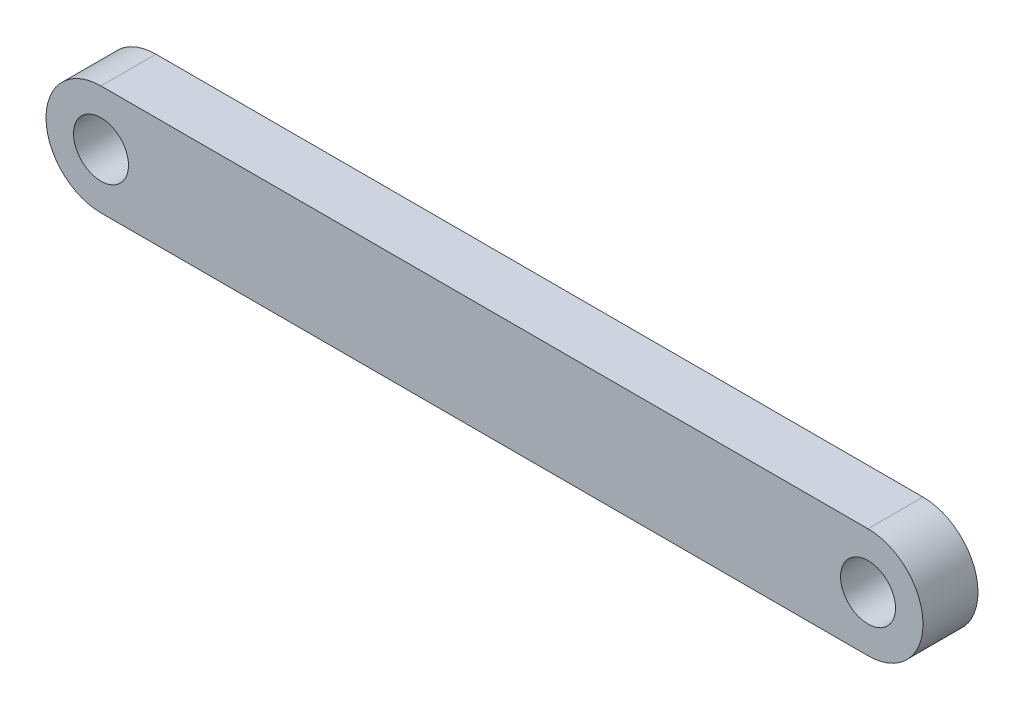
ISO-10303-21;
HEADER;
FILE_DESCRIPTION(('STEP AP214'),'2;1');
FILE_NAME('part.step','',(''),(''),'','','');
FILE_SCHEMA(('AUTOMOTIVE_DESIGN { 1 0 10303 214 1 1 1 1 }'));
ENDSEC;
DATA;
#1=APPLICATION_CONTEXT('core data for automotive mechanical design processes');
#2=APPLICATION_PROTOCOL_DEFINITION('international standard','automotive_design',2000,#1);
#3=PRODUCT_CONTEXT('',#1,'mechanical');
#4=PRODUCT('Part','Part','',(#3));
#5=PRODUCT_RELATED_PRODUCT_CATEGORY('part','',(#4));
#6=PRODUCT_DEFINITION_FORMATION('','',#4);
#7=PRODUCT_DEFINITION_CONTEXT('part definition',#1,'design');
#8=PRODUCT_DEFINITION('design','',#6,#7);
#9=PRODUCT_DEFINITION_SHAPE('','',#8);
#10=(LENGTH_UNIT() NAMED_UNIT(*) SI_UNIT(.MILLI.,.METRE.));
#11=(NAMED_UNIT(*) PLANE_ANGLE_UNIT() SI_UNIT($,.RADIAN.));
#12=(NAMED_UNIT(*) SI_UNIT($,.STERADIAN.) SOLID_ANGLE_UNIT());
#13=UNCERTAINTY_MEASURE_WITH_UNIT(LENGTH_MEASURE(1.E-05),#10,'distance_accuracy_value','');
#14=(GEOMETRIC_REPRESENTATION_CONTEXT(3) GLOBAL_UNCERTAINTY_ASSIGNED_CONTEXT((#13)) GLOBAL_UNIT_ASSIGNED_CONTEXT((#10,
#11,#12)) REPRESENTATION_CONTEXT('',''));
#15=CARTESIAN_POINT('',(0.,0.,0.));
#16=DIRECTION('',(0.,0.,1.));
#17=DIRECTION('',(1.,0.,0.));
#18=AXIS2_PLACEMENT_3D('',#15,#16,#17);
#19=CARTESIAN_POINT('',(-13.9499999814304,0.000719785371182922,2.));
#20=DIRECTION('',(0.,0.,1.));
#21=DIRECTION('',(1.,0.,0.));
#22=AXIS2_PLACEMENT_3D('',#19,#20,#21);
#23=PLANE('',#22);
#24=CARTESIAN_POINT('',(-13.9499999814304,0.000719785371182922,2.));
#25=DIRECTION('',(0.,0.,1.));
#26=DIRECTION('',(1.,0.,0.));
#27=AXIS2_PLACEMENT_3D('',#24,#25,#26);
#28=CIRCLE('',#27,1.);
#29=CARTESIAN_POINT('',(-12.9499999814304,0.000719785371182922,2.));
#30=VERTEX_POINT('',#29);
#31=EDGE_CURVE('E100',#30,#30,#28,.T.);
#32=ORIENTED_EDGE('',*,*,#31,.F.);
#33=EDGE_LOOP('',(#32));
#34=FACE_BOUND('',#33,.T.);
#35=CARTESIAN_POINT('',(-13.9499999814304,0.000719785371182922,2.));
#36=DIRECTION('',(0.,0.,1.));
#37=DIRECTION('',(1.,0.,0.));
#38=AXIS2_PLACEMENT_3D('',#35,#36,#37);
#39=CIRCLE('',#38,2.);
#40=CARTESIAN_POINT('',(-13.9499999814304,2.00071978537118,2.));
#41=VERTEX_POINT('',#40);
#42=CARTESIAN_POINT('',(-13.9499999814304,-1.99928021462882,2.));
#43=VERTEX_POINT('',#42);
#44=EDGE_CURVE('E85',#41,#43,#39,.T.);
#45=ORIENTED_EDGE('',*,*,#44,.T.);
#46=DIRECTION('',(1.,0.,0.));
#47=VECTOR('',#46,1.);
#48=CARTESIAN_POINT('',(-13.9499999814304,-1.99928021462882,2.));
#49=LINE('',#48,#47);
#50=CARTESIAN_POINT('',(13.9500000185696,-1.99928021462882,2.));
#51=VERTEX_POINT('',#50);
#52=EDGE_CURVE('E80',#43,#51,#49,.T.);
#53=ORIENTED_EDGE('',*,*,#52,.T.);
#54=CARTESIAN_POINT('',(13.9500000185696,0.000719785371182922,2.));
#55=DIRECTION('',(0.,0.,1.));
#56=DIRECTION('',(1.,0.,0.));
#57=AXIS2_PLACEMENT_3D('',#54,#55,#56);
#58=CIRCLE('',#57,2.);
#59=CARTESIAN_POINT('',(13.9500000185696,2.00071978537118,2.));
#60=VERTEX_POINT('',#59);
#61=EDGE_CURVE('E83',#51,#60,#58,.T.);
#62=ORIENTED_EDGE('',*,*,#61,.T.);
#63=DIRECTION('',(-1.,0.,0.));
#64=VECTOR('',#63,1.);
#65=CARTESIAN_POINT('',(-13.9499999814304,2.00071978537118,2.));
#66=LINE('',#65,#64);
#67=EDGE_CURVE('E50',#60,#41,#66,.T.);
#68=ORIENTED_EDGE('',*,*,#67,.T.);
#69=EDGE_LOOP('',(#45,#53,#62,#68));
#70=FACE_BOUND('',#69,.T.);
#71=CARTESIAN_POINT('',(13.9500000185696,0.000719785371182922,2.));
#72=DIRECTION('',(0.,0.,1.));
#73=DIRECTION('',(1.,0.,0.));
#74=AXIS2_PLACEMENT_3D('',#71,#72,#73);
#75=CIRCLE('',#74,1.);
#76=CARTESIAN_POINT('',(14.9500000185696,0.000719785371182922,2.));
#77=VERTEX_POINT('',#76);
#78=EDGE_CURVE('E115',#77,#77,#75,.T.);
#79=ORIENTED_EDGE('',*,*,#78,.F.);
#80=EDGE_LOOP('',(#79));
#81=FACE_BOUND('',#80,.T.);
#82=ADVANCED_FACE('F33',(#34,#70,#81),#23,.T.);
#83=CARTESIAN_POINT('',(-13.9499999814304,0.000719785371182922,0.));
#84=DIRECTION('',(0.,0.,1.));
#85=DIRECTION('',(1.,0.,0.));
#86=AXIS2_PLACEMENT_3D('',#83,#84,#85);
#87=PLANE('',#86);
#88=CARTESIAN_POINT('',(-13.9499999814304,0.000719785371182922,0.));
#89=DIRECTION('',(0.,0.,1.));
#90=DIRECTION('',(1.,0.,0.));
#91=AXIS2_PLACEMENT_3D('',#88,#89,#90);
#92=CIRCLE('',#91,2.);
#93=CARTESIAN_POINT('',(-13.9499999814304,2.00071978537118,0.));
#94=VERTEX_POINT('',#93);
#95=CARTESIAN_POINT('',(-13.9499999814304,-1.99928021462882,0.));
#96=VERTEX_POINT('',#95);
#97=EDGE_CURVE('E97',#94,#96,#92,.T.);
#98=ORIENTED_EDGE('',*,*,#97,.F.);
#99=DIRECTION('',(-1.,0.,0.));
#100=VECTOR('',#99,1.);
#101=CARTESIAN_POINT('',(-13.9499999814304,2.00071978537118,0.));
#102=LINE('',#101,#100);
#103=CARTESIAN_POINT('',(13.9500000185696,2.00071978537118,0.));
#104=VERTEX_POINT('',#103);
#105=EDGE_CURVE('E73',#104,#94,#102,.T.);
#106=ORIENTED_EDGE('',*,*,#105,.F.);
#107=CARTESIAN_POINT('',(13.9500000185696,0.000719785371182922,0.));
#108=DIRECTION('',(0.,0.,1.));
#109=DIRECTION('',(1.,0.,0.));
#110=AXIS2_PLACEMENT_3D('',#107,#108,#109);
#111=CIRCLE('',#110,2.);
#112=CARTESIAN_POINT('',(13.9500000185696,-1.99928021462882,0.));
#113=VERTEX_POINT('',#112);
#114=EDGE_CURVE('E67',#113,#104,#111,.T.);
#115=ORIENTED_EDGE('',*,*,#114,.F.);
#116=DIRECTION('',(1.,0.,0.));
#117=VECTOR('',#116,1.);
#118=CARTESIAN_POINT('',(-13.9499999814304,-1.99928021462882,0.));
#119=LINE('',#118,#117);
#120=EDGE_CURVE('E89',#96,#113,#119,.T.);
#121=ORIENTED_EDGE('',*,*,#120,.F.);
#122=EDGE_LOOP('',(#98,#106,#115,#121));
#123=FACE_BOUND('',#122,.T.);
#124=CARTESIAN_POINT('',(-13.9499999814304,0.000719785371182922,0.));
#125=DIRECTION('',(0.,0.,1.));
#126=DIRECTION('',(1.,0.,0.));
#127=AXIS2_PLACEMENT_3D('',#124,#125,#126);
#128=CIRCLE('',#127,1.);
#129=CARTESIAN_POINT('',(-12.9499999814304,0.000719785371182922,0.));
#130=VERTEX_POINT('',#129);
#131=EDGE_CURVE('E112',#130,#130,#128,.T.);
#132=ORIENTED_EDGE('',*,*,#131,.T.);
#133=EDGE_LOOP('',(#132));
#134=FACE_BOUND('',#133,.T.);
#135=CARTESIAN_POINT('',(13.9500000185696,0.000719785371182922,0.));
#136=DIRECTION('',(0.,0.,1.));
#137=DIRECTION('',(1.,0.,0.));
#138=AXIS2_PLACEMENT_3D('',#135,#136,#137);
#139=CIRCLE('',#138,1.);
#140=CARTESIAN_POINT('',(14.9500000185696,0.000719785371182922,0.));
#141=VERTEX_POINT('',#140);
#142=EDGE_CURVE('E118',#141,#141,#139,.T.);
#143=ORIENTED_EDGE('',*,*,#142,.T.);
#144=EDGE_LOOP('',(#143));
#145=FACE_BOUND('',#144,.T.);
#146=ADVANCED_FACE('F108',(#123,#134,#145),#87,.F.);
#147=CARTESIAN_POINT('',(-13.9499999814304,0.000719785371182922,2.));
#148=DIRECTION('',(0.,0.,-1.));
#149=DIRECTION('',(-1.,0.,0.));
#150=AXIS2_PLACEMENT_3D('',#147,#148,#149);
#151=CYLINDRICAL_SURFACE('',#150,2.);
#152=ORIENTED_EDGE('',*,*,#97,.T.);
#153=DIRECTION('',(0.,0.,-1.));
#154=VECTOR('',#153,1.);
#155=CARTESIAN_POINT('',(-13.9499999814304,-1.99928021462882,2.));
#156=LINE('',#155,#154);
#157=EDGE_CURVE('E11',#43,#96,#156,.T.);
#158=ORIENTED_EDGE('',*,*,#157,.F.);
#159=ORIENTED_EDGE('',*,*,#44,.F.);
#160=DIRECTION('',(0.,0.,-1.));
#161=VECTOR('',#160,1.);
#162=CARTESIAN_POINT('',(-13.9499999814304,2.00071978537118,2.));
#163=LINE('',#162,#161);
#164=EDGE_CURVE('E93',#41,#94,#163,.T.);
#165=ORIENTED_EDGE('',*,*,#164,.T.);
#166=EDGE_LOOP('',(#152,#158,#159,#165));
#167=FACE_BOUND('',#166,.T.);
#168=ADVANCED_FACE('F35',(#167),#151,.T.);
#169=CARTESIAN_POINT('',(-13.9499999814304,-1.99928021462882,2.));
#170=DIRECTION('',(0.,1.,0.));
#171=DIRECTION('',(0.,0.,1.));
#172=AXIS2_PLACEMENT_3D('',#169,#170,#171);
#173=PLANE('',#172);
#174=ORIENTED_EDGE('',*,*,#120,.T.);
#175=DIRECTION('',(0.,0.,-1.));
#176=VECTOR('',#175,1.);
#177=CARTESIAN_POINT('',(13.9500000185696,-1.99928021462882,2.));
#178=LINE('',#177,#176);
#179=EDGE_CURVE('E42',#51,#113,#178,.T.);
#180=ORIENTED_EDGE('',*,*,#179,.F.);
#181=ORIENTED_EDGE('',*,*,#52,.F.);
#182=ORIENTED_EDGE('',*,*,#157,.T.);
#183=EDGE_LOOP('',(#174,#180,#181,#182));
#184=FACE_BOUND('',#183,.T.);
#185=ADVANCED_FACE('F88',(#184),#173,.F.);
#186=CARTESIAN_POINT('',(13.9500000185696,0.000719785371182922,2.));
#187=DIRECTION('',(0.,0.,-1.));
#188=DIRECTION('',(-1.,0.,0.));
#189=AXIS2_PLACEMENT_3D('',#186,#187,#188);
#190=CYLINDRICAL_SURFACE('',#189,2.);
#191=ORIENTED_EDGE('',*,*,#114,.T.);
#192=DIRECTION('',(0.,0.,-1.));
#193=VECTOR('',#192,1.);
#194=CARTESIAN_POINT('',(13.9500000185696,2.00071978537118,2.));
#195=LINE('',#194,#193);
#196=EDGE_CURVE('E90',#60,#104,#195,.T.);
#197=ORIENTED_EDGE('',*,*,#196,.F.);
#198=ORIENTED_EDGE('',*,*,#61,.F.);
#199=ORIENTED_EDGE('',*,*,#179,.T.);
#200=EDGE_LOOP('',(#191,#197,#198,#199));
#201=FACE_BOUND('',#200,.T.);
#202=ADVANCED_FACE('F91',(#201),#190,.T.);
#203=CARTESIAN_POINT('',(-13.9499999814304,2.00071978537118,2.));
#204=DIRECTION('',(0.,-1.,0.));
#205=DIRECTION('',(0.,0.,-1.));
#206=AXIS2_PLACEMENT_3D('',#203,#204,#205);
#207=PLANE('',#206);
#208=ORIENTED_EDGE('',*,*,#105,.T.);
#209=ORIENTED_EDGE('',*,*,#164,.F.);
#210=ORIENTED_EDGE('',*,*,#67,.F.);
#211=ORIENTED_EDGE('',*,*,#196,.T.);
#212=EDGE_LOOP('',(#208,#209,#210,#211));
#213=FACE_BOUND('',#212,.T.);
#214=ADVANCED_FACE('F105',(#213),#207,.F.);
#215=CARTESIAN_POINT('',(-13.9499999814304,0.000719785371182922,2.));
#216=DIRECTION('',(0.,0.,-1.));
#217=DIRECTION('',(-1.,0.,0.));
#218=AXIS2_PLACEMENT_3D('',#215,#216,#217);
#219=CYLINDRICAL_SURFACE('',#218,1.);
#220=ORIENTED_EDGE('',*,*,#31,.T.);
#221=EDGE_LOOP('',(#220));
#222=FACE_BOUND('',#221,.T.);
#223=ORIENTED_EDGE('',*,*,#131,.F.);
#224=EDGE_LOOP('',(#223));
#225=FACE_BOUND('',#224,.T.);
#226=ADVANCED_FACE('F135',(#222,#225),#219,.F.);
#227=CARTESIAN_POINT('',(13.9500000185696,0.000719785371182922,2.));
#228=DIRECTION('',(0.,0.,-1.));
#229=DIRECTION('',(-1.,0.,0.));
#230=AXIS2_PLACEMENT_3D('',#227,#228,#229);
#231=CYLINDRICAL_SURFACE('',#230,1.);
#232=ORIENTED_EDGE('',*,*,#78,.T.);
#233=EDGE_LOOP('',(#232));
#234=FACE_BOUND('',#233,.T.);
#235=ORIENTED_EDGE('',*,*,#142,.F.);
#236=EDGE_LOOP('',(#235));
#237=FACE_BOUND('',#236,.T.);
#238=ADVANCED_FACE('F124',(#234,#237),#231,.F.);
#239=CLOSED_SHELL('',(#82,#146,#168,#185,#202,#214,#226,#238));
#240=MANIFOLD_SOLID_BREP('B2',#239);
#241=ADVANCED_BREP_SHAPE_REPRESENTATION('',(#18,#240),#14);
#242=SHAPE_DEFINITION_REPRESENTATION(#9,#241);
ENDSEC;
END-ISO-10303-21;
